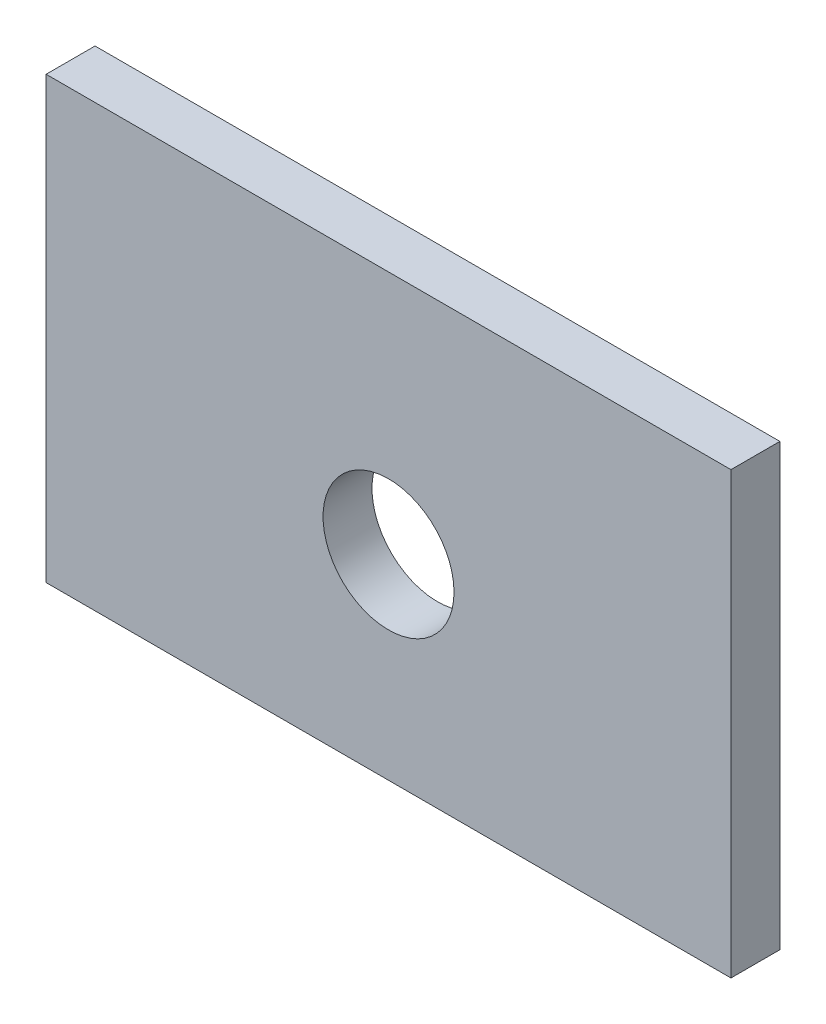
ISO-10303-21;
HEADER;
FILE_DESCRIPTION(('STEP AP214'),'2;1');
FILE_NAME('part.step','',(''),(''),'','','');
FILE_SCHEMA(('AUTOMOTIVE_DESIGN { 1 0 10303 214 1 1 1 1 }'));
ENDSEC;
DATA;
#1=APPLICATION_CONTEXT('core data for automotive mechanical design processes');
#2=APPLICATION_PROTOCOL_DEFINITION('international standard','automotive_design',2000,#1);
#3=PRODUCT_CONTEXT('',#1,'mechanical');
#4=PRODUCT('Part','Part','',(#3));
#5=PRODUCT_RELATED_PRODUCT_CATEGORY('part','',(#4));
#6=PRODUCT_DEFINITION_FORMATION('','',#4);
#7=PRODUCT_DEFINITION_CONTEXT('part definition',#1,'design');
#8=PRODUCT_DEFINITION('design','',#6,#7);
#9=PRODUCT_DEFINITION_SHAPE('','',#8);
#10=(LENGTH_UNIT() NAMED_UNIT(*) SI_UNIT(.MILLI.,.METRE.));
#11=(NAMED_UNIT(*) PLANE_ANGLE_UNIT() SI_UNIT($,.RADIAN.));
#12=(NAMED_UNIT(*) SI_UNIT($,.STERADIAN.) SOLID_ANGLE_UNIT());
#13=UNCERTAINTY_MEASURE_WITH_UNIT(LENGTH_MEASURE(1.E-05),#10,'distance_accuracy_value','');
#14=(GEOMETRIC_REPRESENTATION_CONTEXT(3) GLOBAL_UNCERTAINTY_ASSIGNED_CONTEXT((#13)) GLOBAL_UNIT_ASSIGNED_CONTEXT((#10,
#11,#12)) REPRESENTATION_CONTEXT('',''));
#15=CARTESIAN_POINT('',(0.,0.,0.));
#16=DIRECTION('',(0.,0.,1.));
#17=DIRECTION('',(1.,0.,0.));
#18=AXIS2_PLACEMENT_3D('',#15,#16,#17);
#19=CARTESIAN_POINT('',(44.45,28.575,6.35));
#20=DIRECTION('',(-1.,0.,0.));
#21=DIRECTION('',(0.,-1.,0.));
#22=AXIS2_PLACEMENT_3D('',#19,#20,#21);
#23=PLANE('',#22);
#24=DIRECTION('',(0.,1.,0.));
#25=VECTOR('',#24,1.);
#26=CARTESIAN_POINT('',(44.45,28.575,0.));
#27=LINE('',#26,#25);
#28=CARTESIAN_POINT('',(44.45,-28.575,0.));
#29=VERTEX_POINT('',#28);
#30=CARTESIAN_POINT('',(44.45,28.575,0.));
#31=VERTEX_POINT('',#30);
#32=EDGE_CURVE('E96',#29,#31,#27,.T.);
#33=ORIENTED_EDGE('',*,*,#32,.T.);
#34=DIRECTION('',(0.,0.,-1.));
#35=VECTOR('',#34,1.);
#36=CARTESIAN_POINT('',(44.45,28.575,6.35));
#37=LINE('',#36,#35);
#38=CARTESIAN_POINT('',(44.45,28.575,6.35));
#39=VERTEX_POINT('',#38);
#40=EDGE_CURVE('E11',#39,#31,#37,.T.);
#41=ORIENTED_EDGE('',*,*,#40,.F.);
#42=DIRECTION('',(0.,1.,0.));
#43=VECTOR('',#42,1.);
#44=CARTESIAN_POINT('',(44.45,28.575,6.35));
#45=LINE('',#44,#43);
#46=CARTESIAN_POINT('',(44.45,-28.575,6.35));
#47=VERTEX_POINT('',#46);
#48=EDGE_CURVE('E84',#47,#39,#45,.T.);
#49=ORIENTED_EDGE('',*,*,#48,.F.);
#50=DIRECTION('',(0.,0.,-1.));
#51=VECTOR('',#50,1.);
#52=CARTESIAN_POINT('',(44.45,-28.575,6.35));
#53=LINE('',#52,#51);
#54=EDGE_CURVE('E92',#47,#29,#53,.T.);
#55=ORIENTED_EDGE('',*,*,#54,.T.);
#56=EDGE_LOOP('',(#33,#41,#49,#55));
#57=FACE_BOUND('',#56,.T.);
#58=ADVANCED_FACE('F33',(#57),#23,.F.);
#59=CARTESIAN_POINT('',(-44.45,28.575,6.35));
#60=DIRECTION('',(0.,-1.,0.));
#61=DIRECTION('',(0.,0.,-1.));
#62=AXIS2_PLACEMENT_3D('',#59,#60,#61);
#63=PLANE('',#62);
#64=DIRECTION('',(-1.,0.,0.));
#65=VECTOR('',#64,1.);
#66=CARTESIAN_POINT('',(-44.45,28.575,0.));
#67=LINE('',#66,#65);
#68=CARTESIAN_POINT('',(-44.45,28.575,0.));
#69=VERTEX_POINT('',#68);
#70=EDGE_CURVE('E88',#31,#69,#67,.T.);
#71=ORIENTED_EDGE('',*,*,#70,.T.);
#72=DIRECTION('',(0.,0.,-1.));
#73=VECTOR('',#72,1.);
#74=CARTESIAN_POINT('',(-44.45,28.575,6.35));
#75=LINE('',#74,#73);
#76=CARTESIAN_POINT('',(-44.45,28.575,6.35));
#77=VERTEX_POINT('',#76);
#78=EDGE_CURVE('E41',#77,#69,#75,.T.);
#79=ORIENTED_EDGE('',*,*,#78,.F.);
#80=DIRECTION('',(-1.,0.,0.));
#81=VECTOR('',#80,1.);
#82=CARTESIAN_POINT('',(-44.45,28.575,6.35));
#83=LINE('',#82,#81);
#84=EDGE_CURVE('E79',#39,#77,#83,.T.);
#85=ORIENTED_EDGE('',*,*,#84,.F.);
#86=ORIENTED_EDGE('',*,*,#40,.T.);
#87=EDGE_LOOP('',(#71,#79,#85,#86));
#88=FACE_BOUND('',#87,.T.);
#89=ADVANCED_FACE('F87',(#88),#63,.F.);
#90=CARTESIAN_POINT('',(-44.45,28.575,6.35));
#91=DIRECTION('',(1.,0.,0.));
#92=DIRECTION('',(0.,1.,0.));
#93=AXIS2_PLACEMENT_3D('',#90,#91,#92);
#94=PLANE('',#93);
#95=DIRECTION('',(0.,-1.,0.));
#96=VECTOR('',#95,1.);
#97=CARTESIAN_POINT('',(-44.45,28.575,0.));
#98=LINE('',#97,#96);
#99=CARTESIAN_POINT('',(-44.45,-28.575,0.));
#100=VERTEX_POINT('',#99);
#101=EDGE_CURVE('E66',#69,#100,#98,.T.);
#102=ORIENTED_EDGE('',*,*,#101,.T.);
#103=DIRECTION('',(0.,0.,-1.));
#104=VECTOR('',#103,1.);
#105=CARTESIAN_POINT('',(-44.45,-28.575,6.35));
#106=LINE('',#105,#104);
#107=CARTESIAN_POINT('',(-44.45,-28.575,6.35));
#108=VERTEX_POINT('',#107);
#109=EDGE_CURVE('E89',#108,#100,#106,.T.);
#110=ORIENTED_EDGE('',*,*,#109,.F.);
#111=DIRECTION('',(0.,-1.,0.));
#112=VECTOR('',#111,1.);
#113=CARTESIAN_POINT('',(-44.45,28.575,6.35));
#114=LINE('',#113,#112);
#115=EDGE_CURVE('E82',#77,#108,#114,.T.);
#116=ORIENTED_EDGE('',*,*,#115,.F.);
#117=ORIENTED_EDGE('',*,*,#78,.T.);
#118=EDGE_LOOP('',(#102,#110,#116,#117));
#119=FACE_BOUND('',#118,.T.);
#120=ADVANCED_FACE('F90',(#119),#94,.F.);
#121=CARTESIAN_POINT('',(-44.45,-28.575,6.35));
#122=DIRECTION('',(0.,1.,0.));
#123=DIRECTION('',(0.,0.,1.));
#124=AXIS2_PLACEMENT_3D('',#121,#122,#123);
#125=PLANE('',#124);
#126=DIRECTION('',(1.,0.,0.));
#127=VECTOR('',#126,1.);
#128=CARTESIAN_POINT('',(-44.45,-28.575,0.));
#129=LINE('',#128,#127);
#130=EDGE_CURVE('E72',#100,#29,#129,.T.);
#131=ORIENTED_EDGE('',*,*,#130,.T.);
#132=ORIENTED_EDGE('',*,*,#54,.F.);
#133=DIRECTION('',(1.,0.,0.));
#134=VECTOR('',#133,1.);
#135=CARTESIAN_POINT('',(-44.45,-28.575,6.35));
#136=LINE('',#135,#134);
#137=EDGE_CURVE('E49',#108,#47,#136,.T.);
#138=ORIENTED_EDGE('',*,*,#137,.F.);
#139=ORIENTED_EDGE('',*,*,#109,.T.);
#140=EDGE_LOOP('',(#131,#132,#138,#139));
#141=FACE_BOUND('',#140,.T.);
#142=ADVANCED_FACE('F104',(#141),#125,.F.);
#143=CARTESIAN_POINT('',(0.,0.,6.35));
#144=DIRECTION('',(0.,0.,1.));
#145=DIRECTION('',(1.,0.,0.));
#146=AXIS2_PLACEMENT_3D('',#143,#144,#145);
#147=PLANE('',#146);
#148=CARTESIAN_POINT('',(0.,-3.17499999999998,6.35));
#149=DIRECTION('',(0.,0.,1.));
#150=DIRECTION('',(1.,0.,0.));
#151=AXIS2_PLACEMENT_3D('',#148,#149,#150);
#152=CIRCLE('',#151,8.5);
#153=CARTESIAN_POINT('',(8.5,-3.17499999999998,6.35));
#154=VERTEX_POINT('',#153);
#155=EDGE_CURVE('E112',#154,#154,#152,.T.);
#156=ORIENTED_EDGE('',*,*,#155,.F.);
#157=EDGE_LOOP('',(#156));
#158=FACE_BOUND('',#157,.T.);
#159=ORIENTED_EDGE('',*,*,#48,.T.);
#160=ORIENTED_EDGE('',*,*,#84,.T.);
#161=ORIENTED_EDGE('',*,*,#115,.T.);
#162=ORIENTED_EDGE('',*,*,#137,.T.);
#163=EDGE_LOOP('',(#159,#160,#161,#162));
#164=FACE_BOUND('',#163,.T.);
#165=ADVANCED_FACE('F80',(#158,#164),#147,.T.);
#166=CARTESIAN_POINT('',(0.,0.,0.));
#167=DIRECTION('',(0.,0.,1.));
#168=DIRECTION('',(1.,0.,0.));
#169=AXIS2_PLACEMENT_3D('',#166,#167,#168);
#170=PLANE('',#169);
#171=CARTESIAN_POINT('',(0.,-3.17499999999998,0.));
#172=DIRECTION('',(0.,0.,1.));
#173=DIRECTION('',(1.,0.,0.));
#174=AXIS2_PLACEMENT_3D('',#171,#172,#173);
#175=CIRCLE('',#174,8.5);
#176=CARTESIAN_POINT('',(8.5,-3.17499999999998,0.));
#177=VERTEX_POINT('',#176);
#178=EDGE_CURVE('E99',#177,#177,#175,.F.);
#179=ORIENTED_EDGE('',*,*,#178,.F.);
#180=EDGE_LOOP('',(#179));
#181=FACE_BOUND('',#180,.T.);
#182=ORIENTED_EDGE('',*,*,#32,.F.);
#183=ORIENTED_EDGE('',*,*,#130,.F.);
#184=ORIENTED_EDGE('',*,*,#101,.F.);
#185=ORIENTED_EDGE('',*,*,#70,.F.);
#186=EDGE_LOOP('',(#182,#183,#184,#185));
#187=FACE_BOUND('',#186,.T.);
#188=ADVANCED_FACE('F107',(#181,#187),#170,.F.);
#189=CARTESIAN_POINT('',(0.,-3.17499999999998,-0.00100000000000013));
#190=DIRECTION('',(0.,0.,1.));
#191=DIRECTION('',(1.,0.,0.));
#192=AXIS2_PLACEMENT_3D('',#189,#190,#191);
#193=CYLINDRICAL_SURFACE('',#192,8.5);
#194=ORIENTED_EDGE('',*,*,#155,.T.);
#195=EDGE_LOOP('',(#194));
#196=FACE_BOUND('',#195,.T.);
#197=ORIENTED_EDGE('',*,*,#178,.T.);
#198=EDGE_LOOP('',(#197));
#199=FACE_BOUND('',#198,.T.);
#200=ADVANCED_FACE('F116',(#196,#199),#193,.F.);
#201=CLOSED_SHELL('',(#58,#89,#120,#142,#165,#188,#200));
#202=MANIFOLD_SOLID_BREP('B2',#201);
#203=ADVANCED_BREP_SHAPE_REPRESENTATION('',(#18,#202),#14);
#204=SHAPE_DEFINITION_REPRESENTATION(#9,#203);
ENDSEC;
END-ISO-10303-21;
